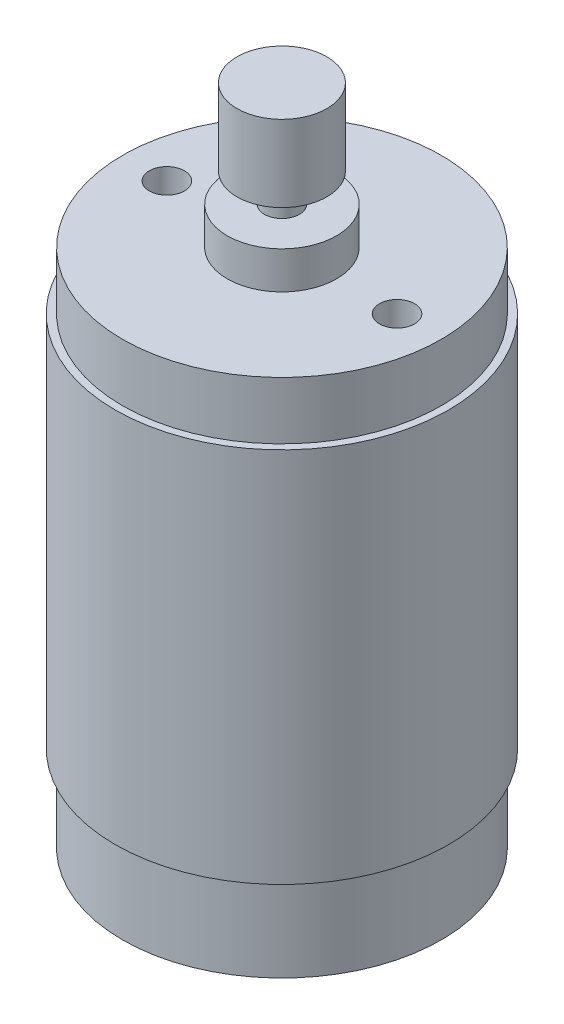
ISO-10303-21;
HEADER;
FILE_DESCRIPTION(('STEP AP214'),'2;1');
FILE_NAME('part.step','',(''),(''),'','','');
FILE_SCHEMA(('AUTOMOTIVE_DESIGN { 1 0 10303 214 1 1 1 1 }'));
ENDSEC;
DATA;
#1=APPLICATION_CONTEXT('core data for automotive mechanical design processes');
#2=APPLICATION_PROTOCOL_DEFINITION('international standard','automotive_design',2000,#1);
#3=PRODUCT_CONTEXT('',#1,'mechanical');
#4=PRODUCT('Part','Part','',(#3));
#5=PRODUCT_RELATED_PRODUCT_CATEGORY('part','',(#4));
#6=PRODUCT_DEFINITION_FORMATION('','',#4);
#7=PRODUCT_DEFINITION_CONTEXT('part definition',#1,'design');
#8=PRODUCT_DEFINITION('design','',#6,#7);
#9=PRODUCT_DEFINITION_SHAPE('','',#8);
#10=(LENGTH_UNIT() NAMED_UNIT(*) SI_UNIT(.MILLI.,.METRE.));
#11=(NAMED_UNIT(*) PLANE_ANGLE_UNIT() SI_UNIT($,.RADIAN.));
#12=(NAMED_UNIT(*) SI_UNIT($,.STERADIAN.) SOLID_ANGLE_UNIT());
#13=UNCERTAINTY_MEASURE_WITH_UNIT(LENGTH_MEASURE(1.E-05),#10,'distance_accuracy_value','');
#14=(GEOMETRIC_REPRESENTATION_CONTEXT(3) GLOBAL_UNCERTAINTY_ASSIGNED_CONTEXT((#13)) GLOBAL_UNIT_ASSIGNED_CONTEXT((#10,
#11,#12)) REPRESENTATION_CONTEXT('',''));
#15=CARTESIAN_POINT('',(0.,0.,0.));
#16=DIRECTION('',(0.,0.,1.));
#17=DIRECTION('',(1.,0.,0.));
#18=AXIS2_PLACEMENT_3D('',#15,#16,#17);
#19=CARTESIAN_POINT('',(0.,0.,0.));
#20=DIRECTION('',(0.,1.,0.));
#21=DIRECTION('',(0.,0.,1.));
#22=AXIS2_PLACEMENT_3D('',#19,#20,#21);
#23=PLANE('',#22);
#24=CARTESIAN_POINT('',(0.,0.,0.));
#25=DIRECTION('',(0.,1.,0.));
#26=DIRECTION('',(0.,0.,1.));
#27=AXIS2_PLACEMENT_3D('',#24,#25,#26);
#28=CIRCLE('',#27,1.5748);
#29=CARTESIAN_POINT('',(0.,0.,1.5748));
#30=VERTEX_POINT('',#29);
#31=EDGE_CURVE('E10',#30,#30,#28,.T.);
#32=ORIENTED_EDGE('',*,*,#31,.F.);
#33=EDGE_LOOP('',(#32));
#34=FACE_BOUND('',#33,.T.);
#35=ADVANCED_FACE('F35',(#34),#23,.F.);
#36=CARTESIAN_POINT('',(0.,67.945,0.));
#37=DIRECTION('',(0.,1.,0.));
#38=DIRECTION('',(0.,0.,1.));
#39=AXIS2_PLACEMENT_3D('',#36,#37,#38);
#40=CYLINDRICAL_SURFACE('',#39,1.5748);
#41=CARTESIAN_POINT('',(0.,5.4102,0.));
#42=DIRECTION('',(0.,1.,0.));
#43=DIRECTION('',(0.,0.,1.));
#44=AXIS2_PLACEMENT_3D('',#41,#42,#43);
#45=CIRCLE('',#44,1.5748);
#46=CARTESIAN_POINT('',(0.,5.4102,1.5748));
#47=VERTEX_POINT('',#46);
#48=EDGE_CURVE('E41',#47,#47,#45,.T.);
#49=ORIENTED_EDGE('',*,*,#48,.F.);
#50=EDGE_LOOP('',(#49));
#51=FACE_BOUND('',#50,.T.);
#52=ORIENTED_EDGE('',*,*,#31,.T.);
#53=EDGE_LOOP('',(#52));
#54=FACE_BOUND('',#53,.T.);
#55=ADVANCED_FACE('F167',(#51,#54),#40,.T.);
#56=CARTESIAN_POINT('',(0.,5.4102,-1.5748));
#57=DIRECTION('',(0.,1.,0.));
#58=DIRECTION('',(0.,0.,1.));
#59=AXIS2_PLACEMENT_3D('',#56,#57,#58);
#60=PLANE('',#59);
#61=CARTESIAN_POINT('',(0.,5.4102,0.));
#62=DIRECTION('',(0.,1.,0.));
#63=DIRECTION('',(0.,0.,1.));
#64=AXIS2_PLACEMENT_3D('',#61,#62,#63);
#65=CIRCLE('',#64,4.9911);
#66=CARTESIAN_POINT('',(0.,5.4102,4.9911));
#67=VERTEX_POINT('',#66);
#68=EDGE_CURVE('E45',#67,#67,#65,.T.);
#69=ORIENTED_EDGE('',*,*,#68,.F.);
#70=EDGE_LOOP('',(#69));
#71=FACE_BOUND('',#70,.T.);
#72=ORIENTED_EDGE('',*,*,#48,.T.);
#73=EDGE_LOOP('',(#72));
#74=FACE_BOUND('',#73,.T.);
#75=ADVANCED_FACE('F162',(#71,#74),#60,.F.);
#76=CARTESIAN_POINT('',(0.,67.945,0.));
#77=DIRECTION('',(0.,1.,0.));
#78=DIRECTION('',(0.,0.,1.));
#79=AXIS2_PLACEMENT_3D('',#76,#77,#78);
#80=CYLINDRICAL_SURFACE('',#79,4.9911);
#81=CARTESIAN_POINT('',(0.,7.9756,0.));
#82=DIRECTION('',(0.,1.,0.));
#83=DIRECTION('',(0.,0.,1.));
#84=AXIS2_PLACEMENT_3D('',#81,#82,#83);
#85=CIRCLE('',#84,4.9911);
#86=CARTESIAN_POINT('',(0.,7.9756,4.9911));
#87=VERTEX_POINT('',#86);
#88=EDGE_CURVE('E49',#87,#87,#85,.T.);
#89=ORIENTED_EDGE('',*,*,#88,.F.);
#90=EDGE_LOOP('',(#89));
#91=FACE_BOUND('',#90,.T.);
#92=ORIENTED_EDGE('',*,*,#68,.T.);
#93=EDGE_LOOP('',(#92));
#94=FACE_BOUND('',#93,.T.);
#95=ADVANCED_FACE('F156',(#91,#94),#80,.T.);
#96=CARTESIAN_POINT('',(0.,7.9756,-4.9911));
#97=DIRECTION('',(0.,1.,0.));
#98=DIRECTION('',(0.,0.,1.));
#99=AXIS2_PLACEMENT_3D('',#96,#97,#98);
#100=PLANE('',#99);
#101=CARTESIAN_POINT('',(0.,7.9756,0.));
#102=DIRECTION('',(0.,1.,0.));
#103=DIRECTION('',(0.,0.,1.));
#104=AXIS2_PLACEMENT_3D('',#101,#102,#103);
#105=CIRCLE('',#104,14.42085);
#106=CARTESIAN_POINT('',(0.,7.9756,14.42085));
#107=VERTEX_POINT('',#106);
#108=EDGE_CURVE('E54',#107,#107,#105,.T.);
#109=ORIENTED_EDGE('',*,*,#108,.F.);
#110=EDGE_LOOP('',(#109));
#111=FACE_BOUND('',#110,.T.);
#112=ORIENTED_EDGE('',*,*,#88,.T.);
#113=EDGE_LOOP('',(#112));
#114=FACE_BOUND('',#113,.T.);
#115=ADVANCED_FACE('F150',(#111,#114),#100,.F.);
#116=CARTESIAN_POINT('',(0.,67.945,0.));
#117=DIRECTION('',(0.,1.,0.));
#118=DIRECTION('',(0.,0.,1.));
#119=AXIS2_PLACEMENT_3D('',#116,#117,#118);
#120=CYLINDRICAL_SURFACE('',#119,14.42085);
#121=CARTESIAN_POINT('',(0.,15.7734,0.));
#122=DIRECTION('',(0.,1.,0.));
#123=DIRECTION('',(0.,0.,1.));
#124=AXIS2_PLACEMENT_3D('',#121,#122,#123);
#125=CIRCLE('',#124,14.42085);
#126=CARTESIAN_POINT('',(0.,15.7734,14.42085));
#127=VERTEX_POINT('',#126);
#128=EDGE_CURVE('E57',#127,#127,#125,.T.);
#129=ORIENTED_EDGE('',*,*,#128,.F.);
#130=EDGE_LOOP('',(#129));
#131=FACE_BOUND('',#130,.T.);
#132=ORIENTED_EDGE('',*,*,#108,.T.);
#133=EDGE_LOOP('',(#132));
#134=FACE_BOUND('',#133,.T.);
#135=ADVANCED_FACE('F144',(#131,#134),#120,.T.);
#136=CARTESIAN_POINT('',(0.,15.7734,-14.42085));
#137=DIRECTION('',(0.,1.,0.));
#138=DIRECTION('',(0.,0.,1.));
#139=AXIS2_PLACEMENT_3D('',#136,#137,#138);
#140=PLANE('',#139);
#141=CARTESIAN_POINT('',(0.,15.7734,0.));
#142=DIRECTION('',(0.,1.,0.));
#143=DIRECTION('',(0.,0.,1.));
#144=AXIS2_PLACEMENT_3D('',#141,#142,#143);
#145=CIRCLE('',#144,15.08125);
#146=CARTESIAN_POINT('',(0.,15.7734,15.08125));
#147=VERTEX_POINT('',#146);
#148=EDGE_CURVE('E60',#147,#147,#145,.T.);
#149=ORIENTED_EDGE('',*,*,#148,.F.);
#150=EDGE_LOOP('',(#149));
#151=FACE_BOUND('',#150,.T.);
#152=ORIENTED_EDGE('',*,*,#128,.T.);
#153=EDGE_LOOP('',(#152));
#154=FACE_BOUND('',#153,.T.);
#155=ADVANCED_FACE('F138',(#151,#154),#140,.F.);
#156=CARTESIAN_POINT('',(0.,67.945,0.));
#157=DIRECTION('',(0.,1.,0.));
#158=DIRECTION('',(0.,0.,1.));
#159=AXIS2_PLACEMENT_3D('',#156,#157,#158);
#160=CYLINDRICAL_SURFACE('',#159,15.08125);
#161=CARTESIAN_POINT('',(0.,49.8348,0.));
#162=DIRECTION('',(0.,1.,0.));
#163=DIRECTION('',(0.,0.,1.));
#164=AXIS2_PLACEMENT_3D('',#161,#162,#163);
#165=CIRCLE('',#164,15.08125);
#166=CARTESIAN_POINT('',(0.,49.8348,15.08125));
#167=VERTEX_POINT('',#166);
#168=EDGE_CURVE('E63',#167,#167,#165,.T.);
#169=ORIENTED_EDGE('',*,*,#168,.F.);
#170=EDGE_LOOP('',(#169));
#171=FACE_BOUND('',#170,.T.);
#172=ORIENTED_EDGE('',*,*,#148,.T.);
#173=EDGE_LOOP('',(#172));
#174=FACE_BOUND('',#173,.T.);
#175=ADVANCED_FACE('F132',(#171,#174),#160,.T.);
#176=CARTESIAN_POINT('',(0.,49.8348,-15.08125));
#177=DIRECTION('',(0.,-1.,0.));
#178=DIRECTION('',(0.,0.,-1.));
#179=AXIS2_PLACEMENT_3D('',#176,#177,#178);
#180=PLANE('',#179);
#181=CARTESIAN_POINT('',(0.,49.8348,0.));
#182=DIRECTION('',(0.,1.,0.));
#183=DIRECTION('',(0.,0.,1.));
#184=AXIS2_PLACEMENT_3D('',#181,#182,#183);
#185=CIRCLE('',#184,14.42085);
#186=CARTESIAN_POINT('',(0.,49.8348,14.42085));
#187=VERTEX_POINT('',#186);
#188=EDGE_CURVE('E66',#187,#187,#185,.T.);
#189=ORIENTED_EDGE('',*,*,#188,.F.);
#190=EDGE_LOOP('',(#189));
#191=FACE_BOUND('',#190,.T.);
#192=ORIENTED_EDGE('',*,*,#168,.T.);
#193=EDGE_LOOP('',(#192));
#194=FACE_BOUND('',#193,.T.);
#195=ADVANCED_FACE('F126',(#191,#194),#180,.F.);
#196=CARTESIAN_POINT('',(0.,67.945,0.));
#197=DIRECTION('',(0.,1.,0.));
#198=DIRECTION('',(0.,0.,1.));
#199=AXIS2_PLACEMENT_3D('',#196,#197,#198);
#200=CYLINDRICAL_SURFACE('',#199,14.42085);
#201=CARTESIAN_POINT('',(0.,55.0418,0.));
#202=DIRECTION('',(0.,1.,0.));
#203=DIRECTION('',(0.,0.,1.));
#204=AXIS2_PLACEMENT_3D('',#201,#202,#203);
#205=CIRCLE('',#204,14.42085);
#206=CARTESIAN_POINT('',(0.,55.0418,14.42085));
#207=VERTEX_POINT('',#206);
#208=EDGE_CURVE('E69',#207,#207,#205,.T.);
#209=ORIENTED_EDGE('',*,*,#208,.F.);
#210=EDGE_LOOP('',(#209));
#211=FACE_BOUND('',#210,.T.);
#212=ORIENTED_EDGE('',*,*,#188,.T.);
#213=EDGE_LOOP('',(#212));
#214=FACE_BOUND('',#213,.T.);
#215=ADVANCED_FACE('F116',(#211,#214),#200,.T.);
#216=CARTESIAN_POINT('',(0.,55.0418,-14.42085));
#217=DIRECTION('',(0.,-1.,0.));
#218=DIRECTION('',(0.,0.,-1.));
#219=AXIS2_PLACEMENT_3D('',#216,#217,#218);
#220=PLANE('',#219);
#221=CARTESIAN_POINT('',(-10.414,55.0418,0.));
#222=DIRECTION('',(0.,1.,0.));
#223=DIRECTION('',(0.,0.,1.));
#224=AXIS2_PLACEMENT_3D('',#221,#222,#223);
#225=CIRCLE('',#224,1.5875);
#226=CARTESIAN_POINT('',(-10.414,55.0418,1.5875));
#227=VERTEX_POINT('',#226);
#228=EDGE_CURVE('E97',#227,#227,#225,.T.);
#229=ORIENTED_EDGE('',*,*,#228,.F.);
#230=EDGE_LOOP('',(#229));
#231=FACE_BOUND('',#230,.T.);
#232=CARTESIAN_POINT('',(10.414,55.0418,0.));
#233=DIRECTION('',(0.,1.,0.));
#234=DIRECTION('',(0.,0.,-1.));
#235=AXIS2_PLACEMENT_3D('',#232,#233,#234);
#236=CIRCLE('',#235,1.5875);
#237=CARTESIAN_POINT('',(10.414,55.0418,-1.5875));
#238=VERTEX_POINT('',#237);
#239=EDGE_CURVE('E91',#238,#238,#236,.T.);
#240=ORIENTED_EDGE('',*,*,#239,.F.);
#241=EDGE_LOOP('',(#240));
#242=FACE_BOUND('',#241,.T.);
#243=CARTESIAN_POINT('',(0.,55.0418,0.));
#244=DIRECTION('',(0.,1.,0.));
#245=DIRECTION('',(0.,0.,1.));
#246=AXIS2_PLACEMENT_3D('',#243,#244,#245);
#247=CIRCLE('',#246,4.94665);
#248=CARTESIAN_POINT('',(0.,55.0418,4.94665));
#249=VERTEX_POINT('',#248);
#250=EDGE_CURVE('E72',#249,#249,#247,.T.);
#251=ORIENTED_EDGE('',*,*,#250,.F.);
#252=EDGE_LOOP('',(#251));
#253=FACE_BOUND('',#252,.T.);
#254=ORIENTED_EDGE('',*,*,#208,.T.);
#255=EDGE_LOOP('',(#254));
#256=FACE_BOUND('',#255,.T.);
#257=ADVANCED_FACE('F112',(#231,#242,#253,#256),#220,.F.);
#258=CARTESIAN_POINT('',(0.,67.945,0.));
#259=DIRECTION('',(0.,1.,0.));
#260=DIRECTION('',(0.,0.,1.));
#261=AXIS2_PLACEMENT_3D('',#258,#259,#260);
#262=CYLINDRICAL_SURFACE('',#261,4.94665);
#263=CARTESIAN_POINT('',(0.,58.42,0.));
#264=DIRECTION('',(0.,1.,0.));
#265=DIRECTION('',(0.,0.,1.));
#266=AXIS2_PLACEMENT_3D('',#263,#264,#265);
#267=CIRCLE('',#266,4.94665);
#268=CARTESIAN_POINT('',(0.,58.42,4.94665));
#269=VERTEX_POINT('',#268);
#270=EDGE_CURVE('E75',#269,#269,#267,.T.);
#271=ORIENTED_EDGE('',*,*,#270,.F.);
#272=EDGE_LOOP('',(#271));
#273=FACE_BOUND('',#272,.T.);
#274=ORIENTED_EDGE('',*,*,#250,.T.);
#275=EDGE_LOOP('',(#274));
#276=FACE_BOUND('',#275,.T.);
#277=ADVANCED_FACE('F115',(#273,#276),#262,.T.);
#278=CARTESIAN_POINT('',(0.,58.42,-4.94665));
#279=DIRECTION('',(0.,-1.,0.));
#280=DIRECTION('',(0.,0.,-1.));
#281=AXIS2_PLACEMENT_3D('',#278,#279,#280);
#282=PLANE('',#281);
#283=CARTESIAN_POINT('',(0.,58.42,0.));
#284=DIRECTION('',(0.,1.,0.));
#285=DIRECTION('',(0.,0.,1.));
#286=AXIS2_PLACEMENT_3D('',#283,#284,#285);
#287=CIRCLE('',#286,1.5875);
#288=CARTESIAN_POINT('',(0.,58.42,1.5875));
#289=VERTEX_POINT('',#288);
#290=EDGE_CURVE('E78',#289,#289,#287,.T.);
#291=ORIENTED_EDGE('',*,*,#290,.F.);
#292=EDGE_LOOP('',(#291));
#293=FACE_BOUND('',#292,.T.);
#294=ORIENTED_EDGE('',*,*,#270,.T.);
#295=EDGE_LOOP('',(#294));
#296=FACE_BOUND('',#295,.T.);
#297=ADVANCED_FACE('F238',(#293,#296),#282,.F.);
#298=CARTESIAN_POINT('',(0.,67.945,0.));
#299=DIRECTION('',(0.,1.,0.));
#300=DIRECTION('',(0.,0.,1.));
#301=AXIS2_PLACEMENT_3D('',#298,#299,#300);
#302=CYLINDRICAL_SURFACE('',#301,1.5875);
#303=CARTESIAN_POINT('',(0.,61.0235,0.));
#304=DIRECTION('',(0.,1.,0.));
#305=DIRECTION('',(0.,0.,1.));
#306=AXIS2_PLACEMENT_3D('',#303,#304,#305);
#307=CIRCLE('',#306,1.5875);
#308=CARTESIAN_POINT('',(0.,61.0235,1.5875));
#309=VERTEX_POINT('',#308);
#310=EDGE_CURVE('E81',#309,#309,#307,.T.);
#311=ORIENTED_EDGE('',*,*,#310,.F.);
#312=EDGE_LOOP('',(#311));
#313=FACE_BOUND('',#312,.T.);
#314=ORIENTED_EDGE('',*,*,#290,.T.);
#315=EDGE_LOOP('',(#314));
#316=FACE_BOUND('',#315,.T.);
#317=ADVANCED_FACE('F248',(#313,#316),#302,.T.);
#318=CARTESIAN_POINT('',(0.,61.0235,-1.5875));
#319=DIRECTION('',(0.,1.,0.));
#320=DIRECTION('',(0.,0.,1.));
#321=AXIS2_PLACEMENT_3D('',#318,#319,#320);
#322=PLANE('',#321);
#323=CARTESIAN_POINT('',(0.,61.0235,0.));
#324=DIRECTION('',(0.,1.,0.));
#325=DIRECTION('',(0.,0.,1.));
#326=AXIS2_PLACEMENT_3D('',#323,#324,#325);
#327=CIRCLE('',#326,4.064);
#328=CARTESIAN_POINT('',(0.,61.0235,4.064));
#329=VERTEX_POINT('',#328);
#330=EDGE_CURVE('E84',#329,#329,#327,.T.);
#331=ORIENTED_EDGE('',*,*,#330,.F.);
#332=EDGE_LOOP('',(#331));
#333=FACE_BOUND('',#332,.T.);
#334=ORIENTED_EDGE('',*,*,#310,.T.);
#335=EDGE_LOOP('',(#334));
#336=FACE_BOUND('',#335,.T.);
#337=ADVANCED_FACE('F258',(#333,#336),#322,.F.);
#338=CARTESIAN_POINT('',(0.,67.945,0.));
#339=DIRECTION('',(0.,1.,0.));
#340=DIRECTION('',(0.,0.,1.));
#341=AXIS2_PLACEMENT_3D('',#338,#339,#340);
#342=CYLINDRICAL_SURFACE('',#341,4.064);
#343=CARTESIAN_POINT('',(0.,67.945,0.));
#344=DIRECTION('',(0.,1.,0.));
#345=DIRECTION('',(0.,0.,1.));
#346=AXIS2_PLACEMENT_3D('',#343,#344,#345);
#347=CIRCLE('',#346,4.064);
#348=CARTESIAN_POINT('',(0.,67.945,4.064));
#349=VERTEX_POINT('',#348);
#350=EDGE_CURVE('E87',#349,#349,#347,.T.);
#351=ORIENTED_EDGE('',*,*,#350,.F.);
#352=EDGE_LOOP('',(#351));
#353=FACE_BOUND('',#352,.T.);
#354=ORIENTED_EDGE('',*,*,#330,.T.);
#355=EDGE_LOOP('',(#354));
#356=FACE_BOUND('',#355,.T.);
#357=ADVANCED_FACE('F268',(#353,#356),#342,.T.);
#358=CARTESIAN_POINT('',(0.,67.945,-4.064));
#359=DIRECTION('',(0.,-1.,0.));
#360=DIRECTION('',(0.,0.,-1.));
#361=AXIS2_PLACEMENT_3D('',#358,#359,#360);
#362=PLANE('',#361);
#363=ORIENTED_EDGE('',*,*,#350,.T.);
#364=EDGE_LOOP('',(#363));
#365=FACE_BOUND('',#364,.T.);
#366=ADVANCED_FACE('F278',(#365),#362,.F.);
#367=CARTESIAN_POINT('',(10.414,48.6918,0.));
#368=DIRECTION('',(0.,1.,0.));
#369=DIRECTION('',(0.,0.,1.));
#370=AXIS2_PLACEMENT_3D('',#367,#368,#369);
#371=CYLINDRICAL_SURFACE('',#370,1.5875);
#372=CARTESIAN_POINT('',(10.414,48.6918,0.));
#373=DIRECTION('',(0.,1.,0.));
#374=DIRECTION('',(0.,0.,-1.));
#375=AXIS2_PLACEMENT_3D('',#372,#373,#374);
#376=CIRCLE('',#375,1.5875);
#377=CARTESIAN_POINT('',(10.414,48.6918,-1.5875));
#378=VERTEX_POINT('',#377);
#379=EDGE_CURVE('E94',#378,#378,#376,.T.);
#380=ORIENTED_EDGE('',*,*,#379,.F.);
#381=EDGE_LOOP('',(#380));
#382=FACE_BOUND('',#381,.T.);
#383=ORIENTED_EDGE('',*,*,#239,.T.);
#384=EDGE_LOOP('',(#383));
#385=FACE_BOUND('',#384,.T.);
#386=ADVANCED_FACE('F287',(#382,#385),#371,.F.);
#387=CARTESIAN_POINT('',(10.414,48.6918,0.));
#388=DIRECTION('',(0.,-1.,0.));
#389=DIRECTION('',(0.,0.,-1.));
#390=AXIS2_PLACEMENT_3D('',#387,#388,#389);
#391=PLANE('',#390);
#392=ORIENTED_EDGE('',*,*,#379,.T.);
#393=EDGE_LOOP('',(#392));
#394=FACE_BOUND('',#393,.T.);
#395=ADVANCED_FACE('F108',(#394),#391,.F.);
#396=CARTESIAN_POINT('',(-10.414,48.6918,0.));
#397=DIRECTION('',(0.,1.,0.));
#398=DIRECTION('',(0.,0.,1.));
#399=AXIS2_PLACEMENT_3D('',#396,#397,#398);
#400=CYLINDRICAL_SURFACE('',#399,1.5875);
#401=CARTESIAN_POINT('',(-10.414,48.6918,0.));
#402=DIRECTION('',(0.,1.,0.));
#403=DIRECTION('',(0.,0.,1.));
#404=AXIS2_PLACEMENT_3D('',#401,#402,#403);
#405=CIRCLE('',#404,1.5875);
#406=CARTESIAN_POINT('',(-10.414,48.6918,1.5875));
#407=VERTEX_POINT('',#406);
#408=EDGE_CURVE('E90',#407,#407,#405,.T.);
#409=ORIENTED_EDGE('',*,*,#408,.F.);
#410=EDGE_LOOP('',(#409));
#411=FACE_BOUND('',#410,.T.);
#412=ORIENTED_EDGE('',*,*,#228,.T.);
#413=EDGE_LOOP('',(#412));
#414=FACE_BOUND('',#413,.T.);
#415=ADVANCED_FACE('F105',(#411,#414),#400,.F.);
#416=CARTESIAN_POINT('',(-10.414,48.6918,0.));
#417=DIRECTION('',(0.,1.,0.));
#418=DIRECTION('',(0.,0.,1.));
#419=AXIS2_PLACEMENT_3D('',#416,#417,#418);
#420=PLANE('',#419);
#421=ORIENTED_EDGE('',*,*,#408,.T.);
#422=EDGE_LOOP('',(#421));
#423=FACE_BOUND('',#422,.T.);
#424=ADVANCED_FACE('F103',(#423),#420,.T.);
#425=CLOSED_SHELL('',(#35,#55,#75,#95,#115,#135,#155,#175,#195,#215,#257,#277,#297,#317,#337,
#357,#366,#386,#395,#415,#424));
#426=MANIFOLD_SOLID_BREP('B2',#425);
#427=ADVANCED_BREP_SHAPE_REPRESENTATION('',(#18,#426),#14);
#428=SHAPE_DEFINITION_REPRESENTATION(#9,#427);
ENDSEC;
END-ISO-10303-21;
